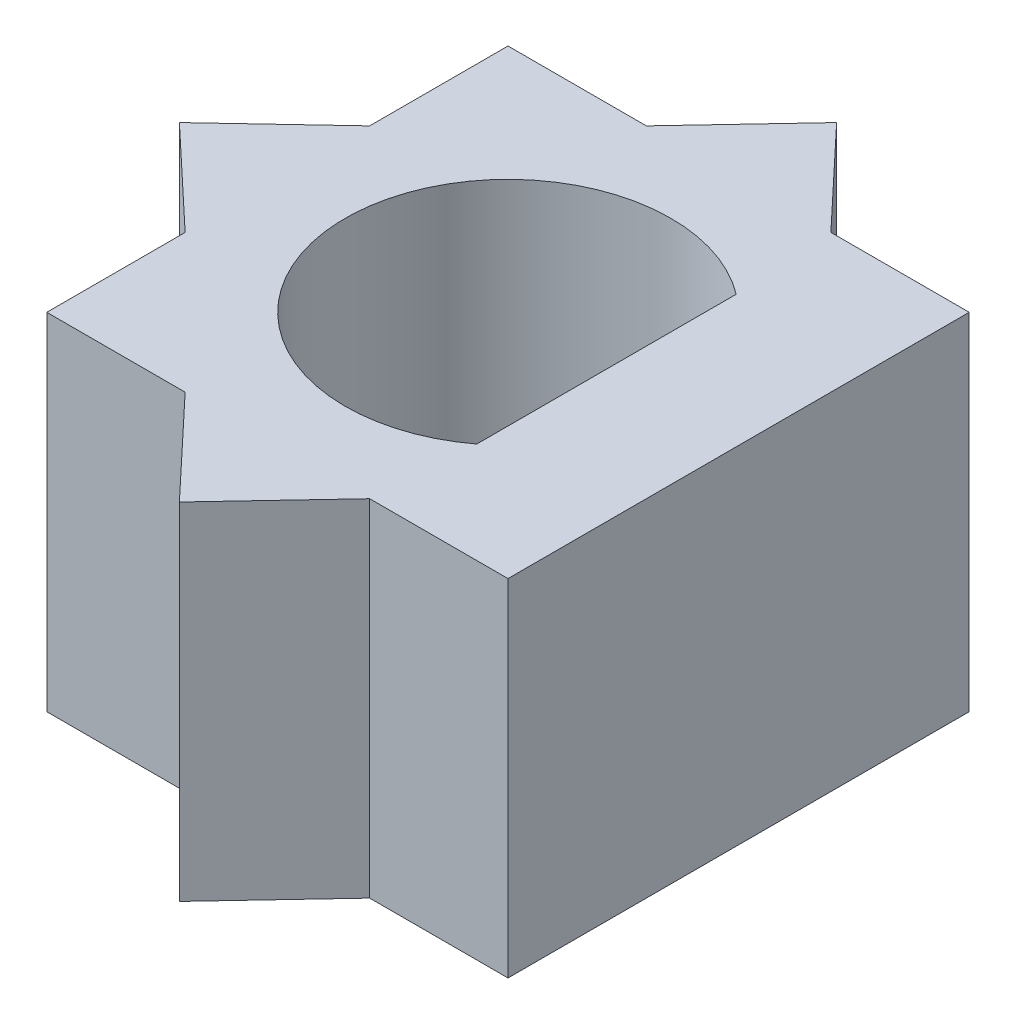
ISO-10303-21;
HEADER;
FILE_DESCRIPTION(('STEP AP214'),'2;1');
FILE_NAME('part.step','',(''),(''),'','','');
FILE_SCHEMA(('AUTOMOTIVE_DESIGN { 1 0 10303 214 1 1 1 1 }'));
ENDSEC;
DATA;
#1=APPLICATION_CONTEXT('core data for automotive mechanical design processes');
#2=APPLICATION_PROTOCOL_DEFINITION('international standard','automotive_design',2000,#1);
#3=PRODUCT_CONTEXT('',#1,'mechanical');
#4=PRODUCT('Part','Part','',(#3));
#5=PRODUCT_RELATED_PRODUCT_CATEGORY('part','',(#4));
#6=PRODUCT_DEFINITION_FORMATION('','',#4);
#7=PRODUCT_DEFINITION_CONTEXT('part definition',#1,'design');
#8=PRODUCT_DEFINITION('design','',#6,#7);
#9=PRODUCT_DEFINITION_SHAPE('','',#8);
#10=(LENGTH_UNIT() NAMED_UNIT(*) SI_UNIT(.MILLI.,.METRE.));
#11=(NAMED_UNIT(*) PLANE_ANGLE_UNIT() SI_UNIT($,.RADIAN.));
#12=(NAMED_UNIT(*) SI_UNIT($,.STERADIAN.) SOLID_ANGLE_UNIT());
#13=UNCERTAINTY_MEASURE_WITH_UNIT(LENGTH_MEASURE(1.E-05),#10,'distance_accuracy_value','');
#14=(GEOMETRIC_REPRESENTATION_CONTEXT(3) GLOBAL_UNCERTAINTY_ASSIGNED_CONTEXT((#13)) GLOBAL_UNIT_ASSIGNED_CONTEXT((#10,
#11,#12)) REPRESENTATION_CONTEXT('',''));
#15=CARTESIAN_POINT('',(0.,0.,0.));
#16=DIRECTION('',(0.,0.,1.));
#17=DIRECTION('',(1.,0.,0.));
#18=AXIS2_PLACEMENT_3D('',#15,#16,#17);
#19=CARTESIAN_POINT('',(-3.99999999999999,6.,0.));
#20=DIRECTION('',(1.,0.,0.));
#21=DIRECTION('',(0.,0.,-1.));
#22=AXIS2_PLACEMENT_3D('',#19,#20,#21);
#23=PLANE('',#22);
#24=DIRECTION('',(0.,0.,1.));
#25=VECTOR('',#24,1.);
#26=CARTESIAN_POINT('',(-3.99999999999999,0.,0.));
#27=LINE('',#26,#25);
#28=CARTESIAN_POINT('',(-4.00000000000001,0.,-3.99999999999994));
#29=VERTEX_POINT('',#28);
#30=CARTESIAN_POINT('',(-4.,0.,-1.59999999999995));
#31=VERTEX_POINT('',#30);
#32=EDGE_CURVE('E185',#29,#31,#27,.T.);
#33=ORIENTED_EDGE('',*,*,#32,.T.);
#34=DIRECTION('',(0.,-1.,0.));
#35=VECTOR('',#34,1.);
#36=CARTESIAN_POINT('',(-4.,6.,-1.59999999999995));
#37=LINE('',#36,#35);
#38=CARTESIAN_POINT('',(-4.,6.,-1.59999999999995));
#39=VERTEX_POINT('',#38);
#40=EDGE_CURVE('E11',#39,#31,#37,.T.);
#41=ORIENTED_EDGE('',*,*,#40,.F.);
#42=DIRECTION('',(0.,0.,1.));
#43=VECTOR('',#42,1.);
#44=CARTESIAN_POINT('',(-3.99999999999999,6.,0.));
#45=LINE('',#44,#43);
#46=CARTESIAN_POINT('',(-4.00000000000001,6.,-3.99999999999994));
#47=VERTEX_POINT('',#46);
#48=EDGE_CURVE('E236',#47,#39,#45,.T.);
#49=ORIENTED_EDGE('',*,*,#48,.F.);
#50=DIRECTION('',(0.,-1.,0.));
#51=VECTOR('',#50,1.);
#52=CARTESIAN_POINT('',(-4.00000000000001,6.,-3.99999999999994));
#53=LINE('',#52,#51);
#54=EDGE_CURVE('E56',#47,#29,#53,.T.);
#55=ORIENTED_EDGE('',*,*,#54,.T.);
#56=EDGE_LOOP('',(#33,#41,#49,#55));
#57=FACE_BOUND('',#56,.T.);
#58=ADVANCED_FACE('F37',(#57),#23,.F.);
#59=CARTESIAN_POINT('',(-2.67743119266045,6.,-2.84477064220183));
#60=DIRECTION('',(-0.685364699004978,0.,-0.728199992692815));
#61=DIRECTION('',(-0.728199992692815,0.,0.685364699004978));
#62=AXIS2_PLACEMENT_3D('',#59,#60,#61);
#63=PLANE('',#62);
#64=DIRECTION('',(0.728199992692815,0.,-0.685364699004978));
#65=VECTOR('',#64,1.);
#66=CARTESIAN_POINT('',(-2.67743119266045,0.,-2.84477064220183));
#67=LINE('',#66,#65);
#68=CARTESIAN_POINT('',(-5.70000000000001,0.,0.));
#69=VERTEX_POINT('',#68);
#70=EDGE_CURVE('E187',#69,#31,#67,.T.);
#71=ORIENTED_EDGE('',*,*,#70,.F.);
#72=DIRECTION('',(0.,-1.,0.));
#73=VECTOR('',#72,1.);
#74=CARTESIAN_POINT('',(-5.70000000000001,6.,0.));
#75=LINE('',#74,#73);
#76=CARTESIAN_POINT('',(-5.70000000000001,6.,0.));
#77=VERTEX_POINT('',#76);
#78=EDGE_CURVE('E47',#77,#69,#75,.T.);
#79=ORIENTED_EDGE('',*,*,#78,.F.);
#80=DIRECTION('',(0.728199992692815,0.,-0.685364699004978));
#81=VECTOR('',#80,1.);
#82=CARTESIAN_POINT('',(-2.67743119266045,6.,-2.84477064220183));
#83=LINE('',#82,#81);
#84=EDGE_CURVE('E239',#77,#39,#83,.T.);
#85=ORIENTED_EDGE('',*,*,#84,.T.);
#86=ORIENTED_EDGE('',*,*,#40,.T.);
#87=EDGE_LOOP('',(#71,#79,#85,#86));
#88=FACE_BOUND('',#87,.T.);
#89=ADVANCED_FACE('F245',(#88),#63,.T.);
#90=CARTESIAN_POINT('',(-2.67743119266062,6.,2.84477064220184));
#91=DIRECTION('',(0.685364699005,0.,-0.728199992692795));
#92=DIRECTION('',(-0.728199992692795,0.,-0.685364699005));
#93=AXIS2_PLACEMENT_3D('',#90,#91,#92);
#94=PLANE('',#93);
#95=DIRECTION('',(0.728199992692795,0.,0.685364699005));
#96=VECTOR('',#95,1.);
#97=CARTESIAN_POINT('',(-2.67743119266062,0.,2.84477064220184));
#98=LINE('',#97,#96);
#99=CARTESIAN_POINT('',(-3.99999999999998,0.,1.60000000000006));
#100=VERTEX_POINT('',#99);
#101=EDGE_CURVE('E191',#69,#100,#98,.T.);
#102=ORIENTED_EDGE('',*,*,#101,.T.);
#103=DIRECTION('',(0.,-1.,0.));
#104=VECTOR('',#103,1.);
#105=CARTESIAN_POINT('',(-3.99999999999998,6.,1.60000000000006));
#106=LINE('',#105,#104);
#107=CARTESIAN_POINT('',(-3.99999999999998,6.,1.60000000000006));
#108=VERTEX_POINT('',#107);
#109=EDGE_CURVE('E229',#108,#100,#106,.T.);
#110=ORIENTED_EDGE('',*,*,#109,.F.);
#111=DIRECTION('',(0.728199992692795,0.,0.685364699005));
#112=VECTOR('',#111,1.);
#113=CARTESIAN_POINT('',(-2.67743119266062,6.,2.84477064220184));
#114=LINE('',#113,#112);
#115=EDGE_CURVE('E247',#77,#108,#114,.T.);
#116=ORIENTED_EDGE('',*,*,#115,.F.);
#117=ORIENTED_EDGE('',*,*,#78,.T.);
#118=EDGE_LOOP('',(#102,#110,#116,#117));
#119=FACE_BOUND('',#118,.T.);
#120=ADVANCED_FACE('F295',(#119),#94,.F.);
#121=CARTESIAN_POINT('',(-3.99999999999997,0.,4.00000000000002));
#122=VERTEX_POINT('',#121);
#123=EDGE_CURVE('E188',#100,#122,#27,.T.);
#124=ORIENTED_EDGE('',*,*,#123,.T.);
#125=DIRECTION('',(0.,-1.,0.));
#126=VECTOR('',#125,1.);
#127=CARTESIAN_POINT('',(-3.99999999999997,6.,4.00000000000002));
#128=LINE('',#127,#126);
#129=CARTESIAN_POINT('',(-3.99999999999997,6.,4.00000000000002));
#130=VERTEX_POINT('',#129);
#131=EDGE_CURVE('E226',#130,#122,#128,.T.);
#132=ORIENTED_EDGE('',*,*,#131,.F.);
#133=EDGE_CURVE('E242',#108,#130,#45,.T.);
#134=ORIENTED_EDGE('',*,*,#133,.F.);
#135=ORIENTED_EDGE('',*,*,#109,.T.);
#136=EDGE_LOOP('',(#124,#132,#134,#135));
#137=FACE_BOUND('',#136,.T.);
#138=ADVANCED_FACE('F291',(#137),#23,.F.);
#139=CARTESIAN_POINT('',(0.,6.,4.));
#140=DIRECTION('',(0.,0.,-1.));
#141=DIRECTION('',(-1.,0.,0.));
#142=AXIS2_PLACEMENT_3D('',#139,#140,#141);
#143=PLANE('',#142);
#144=DIRECTION('',(1.,0.,0.));
#145=VECTOR('',#144,1.);
#146=CARTESIAN_POINT('',(0.,0.,4.));
#147=LINE('',#146,#145);
#148=CARTESIAN_POINT('',(-1.60000000000004,0.,4.00000000000001));
#149=VERTEX_POINT('',#148);
#150=EDGE_CURVE('E193',#122,#149,#147,.T.);
#151=ORIENTED_EDGE('',*,*,#150,.T.);
#152=DIRECTION('',(0.,-1.,0.));
#153=VECTOR('',#152,1.);
#154=CARTESIAN_POINT('',(-1.60000000000004,6.,4.00000000000001));
#155=LINE('',#154,#153);
#156=CARTESIAN_POINT('',(-1.60000000000004,6.,4.00000000000001));
#157=VERTEX_POINT('',#156);
#158=EDGE_CURVE('E224',#157,#149,#155,.T.);
#159=ORIENTED_EDGE('',*,*,#158,.F.);
#160=DIRECTION('',(1.,0.,0.));
#161=VECTOR('',#160,1.);
#162=CARTESIAN_POINT('',(0.,6.,4.));
#163=LINE('',#162,#161);
#164=EDGE_CURVE('E252',#130,#157,#163,.T.);
#165=ORIENTED_EDGE('',*,*,#164,.F.);
#166=ORIENTED_EDGE('',*,*,#131,.T.);
#167=EDGE_LOOP('',(#151,#159,#165,#166));
#168=FACE_BOUND('',#167,.T.);
#169=ADVANCED_FACE('F300',(#168),#143,.F.);
#170=CARTESIAN_POINT('',(-2.84477064220185,6.,2.67743119266061));
#171=DIRECTION('',(-0.728199992692797,0.,0.685364699004997));
#172=DIRECTION('',(0.685364699004997,0.,0.728199992692797));
#173=AXIS2_PLACEMENT_3D('',#170,#171,#172);
#174=PLANE('',#173);
#175=DIRECTION('',(-0.685364699004997,0.,-0.728199992692797));
#176=VECTOR('',#175,1.);
#177=CARTESIAN_POINT('',(-2.84477064220185,0.,2.67743119266061));
#178=LINE('',#177,#176);
#179=CARTESIAN_POINT('',(0.,0.,5.70000000000003));
#180=VERTEX_POINT('',#179);
#181=EDGE_CURVE('E196',#180,#149,#178,.T.);
#182=ORIENTED_EDGE('',*,*,#181,.F.);
#183=DIRECTION('',(0.,-1.,0.));
#184=VECTOR('',#183,1.);
#185=CARTESIAN_POINT('',(0.,6.,5.70000000000003));
#186=LINE('',#185,#184);
#187=CARTESIAN_POINT('',(0.,6.,5.70000000000003));
#188=VERTEX_POINT('',#187);
#189=EDGE_CURVE('E222',#188,#180,#186,.T.);
#190=ORIENTED_EDGE('',*,*,#189,.F.);
#191=DIRECTION('',(-0.685364699004997,0.,-0.728199992692797));
#192=VECTOR('',#191,1.);
#193=CARTESIAN_POINT('',(-2.84477064220185,6.,2.67743119266061));
#194=LINE('',#193,#192);
#195=EDGE_CURVE('E254',#188,#157,#194,.T.);
#196=ORIENTED_EDGE('',*,*,#195,.T.);
#197=ORIENTED_EDGE('',*,*,#158,.T.);
#198=EDGE_LOOP('',(#182,#190,#196,#197));
#199=FACE_BOUND('',#198,.T.);
#200=ADVANCED_FACE('F306',(#199),#174,.T.);
#201=CARTESIAN_POINT('',(2.84477064220184,6.,2.67743119266036));
#202=DIRECTION('',(-0.728199992692828,0.,-0.685364699004964));
#203=DIRECTION('',(-0.685364699004964,0.,0.728199992692828));
#204=AXIS2_PLACEMENT_3D('',#201,#202,#203);
#205=PLANE('',#204);
#206=DIRECTION('',(0.685364699004965,0.,-0.728199992692828));
#207=VECTOR('',#206,1.);
#208=CARTESIAN_POINT('',(2.84477064220184,0.,2.67743119266036));
#209=LINE('',#208,#207);
#210=CARTESIAN_POINT('',(1.59999999999991,0.,4.));
#211=VERTEX_POINT('',#210);
#212=EDGE_CURVE('E200',#180,#211,#209,.T.);
#213=ORIENTED_EDGE('',*,*,#212,.T.);
#214=DIRECTION('',(0.,-1.,0.));
#215=VECTOR('',#214,1.);
#216=CARTESIAN_POINT('',(1.59999999999991,6.,4.));
#217=LINE('',#216,#215);
#218=CARTESIAN_POINT('',(1.59999999999991,6.,4.));
#219=VERTEX_POINT('',#218);
#220=EDGE_CURVE('E219',#219,#211,#217,.T.);
#221=ORIENTED_EDGE('',*,*,#220,.F.);
#222=DIRECTION('',(0.685364699004965,0.,-0.728199992692828));
#223=VECTOR('',#222,1.);
#224=CARTESIAN_POINT('',(2.84477064220184,6.,2.67743119266036));
#225=LINE('',#224,#223);
#226=EDGE_CURVE('E258',#188,#219,#225,.T.);
#227=ORIENTED_EDGE('',*,*,#226,.F.);
#228=ORIENTED_EDGE('',*,*,#189,.T.);
#229=EDGE_LOOP('',(#213,#221,#227,#228));
#230=FACE_BOUND('',#229,.T.);
#231=ADVANCED_FACE('F338',(#230),#205,.F.);
#232=CARTESIAN_POINT('',(3.99999999999989,0.,3.99999999999999));
#233=VERTEX_POINT('',#232);
#234=EDGE_CURVE('E197',#211,#233,#147,.T.);
#235=ORIENTED_EDGE('',*,*,#234,.T.);
#236=DIRECTION('',(0.,-1.,0.));
#237=VECTOR('',#236,1.);
#238=CARTESIAN_POINT('',(3.99999999999989,6.,3.99999999999999));
#239=LINE('',#238,#237);
#240=CARTESIAN_POINT('',(3.99999999999989,6.,3.99999999999999));
#241=VERTEX_POINT('',#240);
#242=EDGE_CURVE('E217',#241,#233,#239,.T.);
#243=ORIENTED_EDGE('',*,*,#242,.F.);
#244=EDGE_CURVE('E255',#219,#241,#163,.T.);
#245=ORIENTED_EDGE('',*,*,#244,.F.);
#246=ORIENTED_EDGE('',*,*,#220,.T.);
#247=EDGE_LOOP('',(#235,#243,#245,#246));
#248=FACE_BOUND('',#247,.T.);
#249=ADVANCED_FACE('F268',(#248),#143,.F.);
#250=CARTESIAN_POINT('',(3.99999999999989,6.,0.));
#251=DIRECTION('',(1.,0.,0.));
#252=DIRECTION('',(0.,0.,-1.));
#253=AXIS2_PLACEMENT_3D('',#250,#251,#252);
#254=PLANE('',#253);
#255=DIRECTION('',(0.,0.,1.));
#256=VECTOR('',#255,1.);
#257=CARTESIAN_POINT('',(3.99999999999989,0.,0.));
#258=LINE('',#257,#256);
#259=CARTESIAN_POINT('',(3.99999999999989,0.,-3.99999999999994));
#260=VERTEX_POINT('',#259);
#261=EDGE_CURVE('E202',#260,#233,#258,.T.);
#262=ORIENTED_EDGE('',*,*,#261,.F.);
#263=DIRECTION('',(0.,-1.,0.));
#264=VECTOR('',#263,1.);
#265=CARTESIAN_POINT('',(3.99999999999989,6.,-3.99999999999994));
#266=LINE('',#265,#264);
#267=CARTESIAN_POINT('',(3.99999999999989,6.,-3.99999999999994));
#268=VERTEX_POINT('',#267);
#269=EDGE_CURVE('E215',#268,#260,#266,.T.);
#270=ORIENTED_EDGE('',*,*,#269,.F.);
#271=DIRECTION('',(0.,0.,1.));
#272=VECTOR('',#271,1.);
#273=CARTESIAN_POINT('',(3.99999999999989,6.,0.));
#274=LINE('',#273,#272);
#275=EDGE_CURVE('E175',#268,#241,#274,.T.);
#276=ORIENTED_EDGE('',*,*,#275,.T.);
#277=ORIENTED_EDGE('',*,*,#242,.T.);
#278=EDGE_LOOP('',(#262,#270,#276,#277));
#279=FACE_BOUND('',#278,.T.);
#280=ADVANCED_FACE('F271',(#279),#254,.T.);
#281=CARTESIAN_POINT('',(0.,6.,-3.99999999999994));
#282=DIRECTION('',(0.,0.,-1.));
#283=DIRECTION('',(-1.,0.,0.));
#284=AXIS2_PLACEMENT_3D('',#281,#282,#283);
#285=PLANE('',#284);
#286=DIRECTION('',(1.,0.,0.));
#287=VECTOR('',#286,1.);
#288=CARTESIAN_POINT('',(0.,0.,-3.99999999999994));
#289=LINE('',#288,#287);
#290=CARTESIAN_POINT('',(1.59999999999989,0.,-3.99999999999994));
#291=VERTEX_POINT('',#290);
#292=EDGE_CURVE('E205',#291,#260,#289,.T.);
#293=ORIENTED_EDGE('',*,*,#292,.F.);
#294=DIRECTION('',(0.,-1.,0.));
#295=VECTOR('',#294,1.);
#296=CARTESIAN_POINT('',(1.59999999999989,6.,-3.99999999999994));
#297=LINE('',#296,#295);
#298=CARTESIAN_POINT('',(1.59999999999989,6.,-3.99999999999994));
#299=VERTEX_POINT('',#298);
#300=EDGE_CURVE('E161',#299,#291,#297,.T.);
#301=ORIENTED_EDGE('',*,*,#300,.F.);
#302=DIRECTION('',(1.,0.,0.));
#303=VECTOR('',#302,1.);
#304=CARTESIAN_POINT('',(0.,6.,-3.99999999999994));
#305=LINE('',#304,#303);
#306=EDGE_CURVE('E173',#299,#268,#305,.T.);
#307=ORIENTED_EDGE('',*,*,#306,.T.);
#308=ORIENTED_EDGE('',*,*,#269,.T.);
#309=EDGE_LOOP('',(#293,#301,#307,#308));
#310=FACE_BOUND('',#309,.T.);
#311=ADVANCED_FACE('F276',(#310),#285,.T.);
#312=CARTESIAN_POINT('',(2.8447706422018,6.,-2.67743119266032));
#313=DIRECTION('',(0.728199992692827,0.,-0.685364699004965));
#314=DIRECTION('',(-0.685364699004965,0.,-0.728199992692827));
#315=AXIS2_PLACEMENT_3D('',#312,#313,#314);
#316=PLANE('',#315);
#317=DIRECTION('',(0.685364699004965,0.,0.728199992692828));
#318=VECTOR('',#317,1.);
#319=CARTESIAN_POINT('',(2.8447706422018,0.,-2.67743119266032));
#320=LINE('',#319,#318);
#321=CARTESIAN_POINT('',(0.,0.,-5.69999999999995));
#322=VERTEX_POINT('',#321);
#323=EDGE_CURVE('E158',#322,#291,#320,.T.);
#324=ORIENTED_EDGE('',*,*,#323,.F.);
#325=DIRECTION('',(0.,-1.,0.));
#326=VECTOR('',#325,1.);
#327=CARTESIAN_POINT('',(0.,6.,-5.69999999999995));
#328=LINE('',#327,#326);
#329=CARTESIAN_POINT('',(0.,6.,-5.69999999999995));
#330=VERTEX_POINT('',#329);
#331=EDGE_CURVE('E152',#330,#322,#328,.T.);
#332=ORIENTED_EDGE('',*,*,#331,.F.);
#333=DIRECTION('',(0.685364699004965,0.,0.728199992692828));
#334=VECTOR('',#333,1.);
#335=CARTESIAN_POINT('',(2.8447706422018,6.,-2.67743119266032));
#336=LINE('',#335,#334);
#337=EDGE_CURVE('E156',#330,#299,#336,.T.);
#338=ORIENTED_EDGE('',*,*,#337,.T.);
#339=ORIENTED_EDGE('',*,*,#300,.T.);
#340=EDGE_LOOP('',(#324,#332,#338,#339));
#341=FACE_BOUND('',#340,.T.);
#342=ADVANCED_FACE('F154',(#341),#316,.T.);
#343=CARTESIAN_POINT('',(-2.84477064220181,6.,-2.67743119266054));
#344=DIRECTION('',(0.728199992692802,0.,0.685364699004992));
#345=DIRECTION('',(0.685364699004992,0.,-0.728199992692802));
#346=AXIS2_PLACEMENT_3D('',#343,#344,#345);
#347=PLANE('',#346);
#348=DIRECTION('',(-0.685364699004992,0.,0.728199992692802));
#349=VECTOR('',#348,1.);
#350=CARTESIAN_POINT('',(-2.84477064220181,0.,-2.67743119266054));
#351=LINE('',#350,#349);
#352=CARTESIAN_POINT('',(-1.60000000000001,0.,-3.99999999999994));
#353=VERTEX_POINT('',#352);
#354=EDGE_CURVE('E210',#322,#353,#351,.T.);
#355=ORIENTED_EDGE('',*,*,#354,.T.);
#356=DIRECTION('',(0.,-1.,0.));
#357=VECTOR('',#356,1.);
#358=CARTESIAN_POINT('',(-1.60000000000001,6.,-3.99999999999994));
#359=LINE('',#358,#357);
#360=CARTESIAN_POINT('',(-1.60000000000001,6.,-3.99999999999994));
#361=VERTEX_POINT('',#360);
#362=EDGE_CURVE('E103',#361,#353,#359,.T.);
#363=ORIENTED_EDGE('',*,*,#362,.F.);
#364=DIRECTION('',(-0.685364699004992,0.,0.728199992692802));
#365=VECTOR('',#364,1.);
#366=CARTESIAN_POINT('',(-2.84477064220181,6.,-2.67743119266054));
#367=LINE('',#366,#365);
#368=EDGE_CURVE('E163',#330,#361,#367,.T.);
#369=ORIENTED_EDGE('',*,*,#368,.F.);
#370=ORIENTED_EDGE('',*,*,#331,.T.);
#371=EDGE_LOOP('',(#355,#363,#369,#370));
#372=FACE_BOUND('',#371,.T.);
#373=ADVANCED_FACE('F164',(#372),#347,.F.);
#374=CARTESIAN_POINT('',(0.,6.,0.));
#375=DIRECTION('',(0.,-1.,0.));
#376=DIRECTION('',(0.,0.,-1.));
#377=AXIS2_PLACEMENT_3D('',#374,#375,#376);
#378=CYLINDRICAL_SURFACE('',#377,2.825);
#379=CARTESIAN_POINT('',(0.,0.,0.));
#380=DIRECTION('',(0.,1.,0.));
#381=DIRECTION('',(0.,0.,1.));
#382=AXIS2_PLACEMENT_3D('',#379,#380,#381);
#383=CIRCLE('',#382,2.825);
#384=CARTESIAN_POINT('',(1.70825203058565,0.,-2.25));
#385=VERTEX_POINT('',#384);
#386=CARTESIAN_POINT('',(1.70825203058565,0.,2.25));
#387=VERTEX_POINT('',#386);
#388=EDGE_CURVE('E179',#385,#387,#383,.T.);
#389=ORIENTED_EDGE('',*,*,#388,.F.);
#390=DIRECTION('',(0.,-1.,0.));
#391=VECTOR('',#390,1.);
#392=CARTESIAN_POINT('',(1.70825203058565,6.,-2.25));
#393=LINE('',#392,#391);
#394=CARTESIAN_POINT('',(1.70825203058565,6.,-2.25));
#395=VERTEX_POINT('',#394);
#396=EDGE_CURVE('E41',#395,#385,#393,.T.);
#397=ORIENTED_EDGE('',*,*,#396,.F.);
#398=CARTESIAN_POINT('',(0.,6.,0.));
#399=DIRECTION('',(0.,1.,0.));
#400=DIRECTION('',(0.,0.,1.));
#401=AXIS2_PLACEMENT_3D('',#398,#399,#400);
#402=CIRCLE('',#401,2.825);
#403=CARTESIAN_POINT('',(1.70825203058565,6.,2.25));
#404=VERTEX_POINT('',#403);
#405=EDGE_CURVE('E322',#395,#404,#402,.T.);
#406=ORIENTED_EDGE('',*,*,#405,.T.);
#407=DIRECTION('',(0.,-1.,0.));
#408=VECTOR('',#407,1.);
#409=CARTESIAN_POINT('',(1.70825203058565,6.,2.25));
#410=LINE('',#409,#408);
#411=EDGE_CURVE('E232',#404,#387,#410,.T.);
#412=ORIENTED_EDGE('',*,*,#411,.T.);
#413=EDGE_LOOP('',(#389,#397,#406,#412));
#414=FACE_BOUND('',#413,.T.);
#415=ADVANCED_FACE('F39',(#414),#378,.F.);
#416=CARTESIAN_POINT('',(1.70825203058565,6.,0.));
#417=DIRECTION('',(1.,0.,0.));
#418=DIRECTION('',(0.,0.,-1.));
#419=AXIS2_PLACEMENT_3D('',#416,#417,#418);
#420=PLANE('',#419);
#421=DIRECTION('',(0.,0.,1.));
#422=VECTOR('',#421,1.);
#423=CARTESIAN_POINT('',(1.70825203058565,0.,0.));
#424=LINE('',#423,#422);
#425=EDGE_CURVE('E182',#385,#387,#424,.T.);
#426=ORIENTED_EDGE('',*,*,#425,.T.);
#427=ORIENTED_EDGE('',*,*,#411,.F.);
#428=DIRECTION('',(0.,0.,1.));
#429=VECTOR('',#428,1.);
#430=CARTESIAN_POINT('',(1.70825203058565,6.,0.));
#431=LINE('',#430,#429);
#432=EDGE_CURVE('E240',#395,#404,#431,.T.);
#433=ORIENTED_EDGE('',*,*,#432,.F.);
#434=ORIENTED_EDGE('',*,*,#396,.T.);
#435=EDGE_LOOP('',(#426,#427,#433,#434));
#436=FACE_BOUND('',#435,.T.);
#437=ADVANCED_FACE('F288',(#436),#420,.F.);
#438=EDGE_CURVE('E208',#29,#353,#289,.T.);
#439=ORIENTED_EDGE('',*,*,#438,.F.);
#440=ORIENTED_EDGE('',*,*,#54,.F.);
#441=EDGE_CURVE('E167',#47,#361,#305,.T.);
#442=ORIENTED_EDGE('',*,*,#441,.T.);
#443=ORIENTED_EDGE('',*,*,#362,.T.);
#444=EDGE_LOOP('',(#439,#440,#442,#443));
#445=FACE_BOUND('',#444,.T.);
#446=ADVANCED_FACE('F234',(#445),#285,.T.);
#447=CARTESIAN_POINT('',(0.,6.,0.));
#448=DIRECTION('',(0.,1.,0.));
#449=DIRECTION('',(0.,0.,1.));
#450=AXIS2_PLACEMENT_3D('',#447,#448,#449);
#451=PLANE('',#450);
#452=ORIENTED_EDGE('',*,*,#405,.F.);
#453=ORIENTED_EDGE('',*,*,#432,.T.);
#454=EDGE_LOOP('',(#452,#453));
#455=FACE_BOUND('',#454,.T.);
#456=ORIENTED_EDGE('',*,*,#48,.T.);
#457=ORIENTED_EDGE('',*,*,#84,.F.);
#458=ORIENTED_EDGE('',*,*,#115,.T.);
#459=ORIENTED_EDGE('',*,*,#133,.T.);
#460=ORIENTED_EDGE('',*,*,#164,.T.);
#461=ORIENTED_EDGE('',*,*,#195,.F.);
#462=ORIENTED_EDGE('',*,*,#226,.T.);
#463=ORIENTED_EDGE('',*,*,#244,.T.);
#464=ORIENTED_EDGE('',*,*,#275,.F.);
#465=ORIENTED_EDGE('',*,*,#306,.F.);
#466=ORIENTED_EDGE('',*,*,#337,.F.);
#467=ORIENTED_EDGE('',*,*,#368,.T.);
#468=ORIENTED_EDGE('',*,*,#441,.F.);
#469=EDGE_LOOP('',(#456,#457,#458,#459,#460,#461,#462,#463,#464,#465,#466,#467,#468));
#470=FACE_BOUND('',#469,.T.);
#471=ADVANCED_FACE('F170',(#455,#470),#451,.T.);
#472=CARTESIAN_POINT('',(0.,0.,0.));
#473=DIRECTION('',(0.,1.,0.));
#474=DIRECTION('',(0.,0.,1.));
#475=AXIS2_PLACEMENT_3D('',#472,#473,#474);
#476=PLANE('',#475);
#477=ORIENTED_EDGE('',*,*,#388,.T.);
#478=ORIENTED_EDGE('',*,*,#425,.F.);
#479=EDGE_LOOP('',(#477,#478));
#480=FACE_BOUND('',#479,.T.);
#481=ORIENTED_EDGE('',*,*,#32,.F.);
#482=ORIENTED_EDGE('',*,*,#438,.T.);
#483=ORIENTED_EDGE('',*,*,#354,.F.);
#484=ORIENTED_EDGE('',*,*,#323,.T.);
#485=ORIENTED_EDGE('',*,*,#292,.T.);
#486=ORIENTED_EDGE('',*,*,#261,.T.);
#487=ORIENTED_EDGE('',*,*,#234,.F.);
#488=ORIENTED_EDGE('',*,*,#212,.F.);
#489=ORIENTED_EDGE('',*,*,#181,.T.);
#490=ORIENTED_EDGE('',*,*,#150,.F.);
#491=ORIENTED_EDGE('',*,*,#123,.F.);
#492=ORIENTED_EDGE('',*,*,#101,.F.);
#493=ORIENTED_EDGE('',*,*,#70,.T.);
#494=EDGE_LOOP('',(#481,#482,#483,#484,#485,#486,#487,#488,#489,#490,#491,#492,#493));
#495=FACE_BOUND('',#494,.T.);
#496=ADVANCED_FACE('F274',(#480,#495),#476,.F.);
#497=CLOSED_SHELL('',(#58,#89,#120,#138,#169,#200,#231,#249,#280,#311,#342,#373,#415,#437,#446,
#471,#496));
#498=MANIFOLD_SOLID_BREP('B2',#497);
#499=ADVANCED_BREP_SHAPE_REPRESENTATION('',(#18,#498),#14);
#500=SHAPE_DEFINITION_REPRESENTATION(#9,#499);
ENDSEC;
END-ISO-10303-21;
